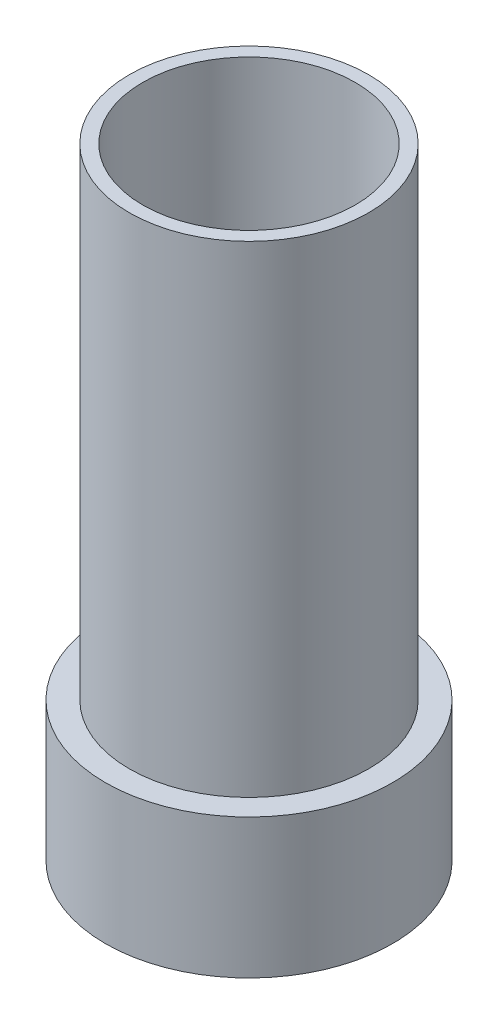
ISO-10303-21;
HEADER;
FILE_DESCRIPTION(('STEP AP214'),'2;1');
FILE_NAME('part.step','',(''),(''),'','','');
FILE_SCHEMA(('AUTOMOTIVE_DESIGN { 1 0 10303 214 1 1 1 1 }'));
ENDSEC;
DATA;
#1=APPLICATION_CONTEXT('core data for automotive mechanical design processes');
#2=APPLICATION_PROTOCOL_DEFINITION('international standard','automotive_design',2000,#1);
#3=PRODUCT_CONTEXT('',#1,'mechanical');
#4=PRODUCT('Part','Part','',(#3));
#5=PRODUCT_RELATED_PRODUCT_CATEGORY('part','',(#4));
#6=PRODUCT_DEFINITION_FORMATION('','',#4);
#7=PRODUCT_DEFINITION_CONTEXT('part definition',#1,'design');
#8=PRODUCT_DEFINITION('design','',#6,#7);
#9=PRODUCT_DEFINITION_SHAPE('','',#8);
#10=(LENGTH_UNIT() NAMED_UNIT(*) SI_UNIT(.MILLI.,.METRE.));
#11=(NAMED_UNIT(*) PLANE_ANGLE_UNIT() SI_UNIT($,.RADIAN.));
#12=(NAMED_UNIT(*) SI_UNIT($,.STERADIAN.) SOLID_ANGLE_UNIT());
#13=UNCERTAINTY_MEASURE_WITH_UNIT(LENGTH_MEASURE(1.E-05),#10,'distance_accuracy_value','');
#14=(GEOMETRIC_REPRESENTATION_CONTEXT(3) GLOBAL_UNCERTAINTY_ASSIGNED_CONTEXT((#13)) GLOBAL_UNIT_ASSIGNED_CONTEXT((#10,
#11,#12)) REPRESENTATION_CONTEXT('',''));
#15=CARTESIAN_POINT('',(0.,0.,0.));
#16=DIRECTION('',(0.,0.,1.));
#17=DIRECTION('',(1.,0.,0.));
#18=AXIS2_PLACEMENT_3D('',#15,#16,#17);
#19=CARTESIAN_POINT('',(13.6326591615901,41.2,-6.07942908557396));
#20=DIRECTION('',(0.,-1.,0.));
#21=DIRECTION('',(0.,0.,-1.));
#22=AXIS2_PLACEMENT_3D('',#19,#20,#21);
#23=CYLINDRICAL_SURFACE('',#22,7.9375);
#24=CARTESIAN_POINT('',(13.6326591615901,41.2,-6.07942908557396));
#25=DIRECTION('',(0.,1.,0.));
#26=DIRECTION('',(0.,0.,1.));
#27=AXIS2_PLACEMENT_3D('',#24,#25,#26);
#28=CIRCLE('',#27,7.9375);
#29=CARTESIAN_POINT('',(13.6326591615901,41.2,-14.016929085574));
#30=VERTEX_POINT('',#29);
#31=EDGE_CURVE('E37',#30,#30,#28,.T.);
#32=CARTESIAN_POINT('',(13.6326591615901,9.25,-6.07942908557396));
#33=DIRECTION('',(0.,-1.,0.));
#34=DIRECTION('',(0.,0.,-1.));
#35=AXIS2_PLACEMENT_3D('',#32,#33,#34);
#36=CIRCLE('',#35,7.9375);
#37=CARTESIAN_POINT('',(13.6326591615901,9.25,-14.016929085574));
#38=VERTEX_POINT('',#37);
#39=EDGE_CURVE('E10',#38,#38,#36,.T.);
#40=CARTESIAN_POINT('',(13.6326591615901,41.2,-14.016929085574));
#41=CARTESIAN_POINT('',(13.6326591615901,40.8671875,-14.016929085574));
#42=CARTESIAN_POINT('',(13.6326591615901,40.534375,-14.016929085574));
#43=CARTESIAN_POINT('',(13.6326591615901,39.86875,-14.016929085574));
#44=CARTESIAN_POINT('',(13.6326591615901,39.5359375,-14.016929085574));
#45=CARTESIAN_POINT('',(13.6326591615901,38.8703125,-14.016929085574));
#46=CARTESIAN_POINT('',(13.6326591615901,38.5375,-14.016929085574));
#47=CARTESIAN_POINT('',(13.6326591615901,37.871875,-14.016929085574));
#48=CARTESIAN_POINT('',(13.6326591615901,37.5390625,-14.016929085574));
#49=CARTESIAN_POINT('',(13.6326591615901,36.8734375,-14.016929085574));
#50=CARTESIAN_POINT('',(13.6326591615901,36.540625,-14.016929085574));
#51=CARTESIAN_POINT('',(13.6326591615901,35.875,-14.016929085574));
#52=CARTESIAN_POINT('',(13.6326591615901,35.5421875,-14.016929085574));
#53=CARTESIAN_POINT('',(13.6326591615901,34.8765625,-14.016929085574));
#54=CARTESIAN_POINT('',(13.6326591615901,34.54375,-14.016929085574));
#55=CARTESIAN_POINT('',(13.6326591615901,33.878125,-14.016929085574));
#56=CARTESIAN_POINT('',(13.6326591615901,33.5453125,-14.016929085574));
#57=CARTESIAN_POINT('',(13.6326591615901,32.8796875,-14.016929085574));
#58=CARTESIAN_POINT('',(13.6326591615901,32.546875,-14.016929085574));
#59=CARTESIAN_POINT('',(13.6326591615901,31.88125,-14.016929085574));
#60=CARTESIAN_POINT('',(13.6326591615901,31.5484375,-14.016929085574));
#61=CARTESIAN_POINT('',(13.6326591615901,30.8828125,-14.016929085574));
#62=CARTESIAN_POINT('',(13.6326591615901,30.55,-14.016929085574));
#63=CARTESIAN_POINT('',(13.6326591615901,29.884375,-14.016929085574));
#64=CARTESIAN_POINT('',(13.6326591615901,29.5515625,-14.016929085574));
#65=CARTESIAN_POINT('',(13.6326591615901,28.8859375,-14.016929085574));
#66=CARTESIAN_POINT('',(13.6326591615901,28.553125,-14.016929085574));
#67=CARTESIAN_POINT('',(13.6326591615901,27.8875,-14.016929085574));
#68=CARTESIAN_POINT('',(13.6326591615901,27.5546875,-14.016929085574));
#69=CARTESIAN_POINT('',(13.6326591615901,26.8890625,-14.016929085574));
#70=CARTESIAN_POINT('',(13.6326591615901,26.55625,-14.016929085574));
#71=CARTESIAN_POINT('',(13.6326591615901,25.890625,-14.016929085574));
#72=CARTESIAN_POINT('',(13.6326591615901,25.5578125,-14.016929085574));
#73=CARTESIAN_POINT('',(13.6326591615901,24.8921875,-14.016929085574));
#74=CARTESIAN_POINT('',(13.6326591615901,24.559375,-14.016929085574));
#75=CARTESIAN_POINT('',(13.6326591615901,23.89375,-14.016929085574));
#76=CARTESIAN_POINT('',(13.6326591615901,23.5609375,-14.016929085574));
#77=CARTESIAN_POINT('',(13.6326591615901,22.8953125,-14.016929085574));
#78=CARTESIAN_POINT('',(13.6326591615901,22.5625,-14.016929085574));
#79=CARTESIAN_POINT('',(13.6326591615901,21.896875,-14.016929085574));
#80=CARTESIAN_POINT('',(13.6326591615901,21.5640625,-14.016929085574));
#81=CARTESIAN_POINT('',(13.6326591615901,20.8984375,-14.016929085574));
#82=CARTESIAN_POINT('',(13.6326591615901,20.565625,-14.016929085574));
#83=CARTESIAN_POINT('',(13.6326591615901,19.9,-14.016929085574));
#84=CARTESIAN_POINT('',(13.6326591615901,19.5671875,-14.016929085574));
#85=CARTESIAN_POINT('',(13.6326591615901,18.9015625,-14.016929085574));
#86=CARTESIAN_POINT('',(13.6326591615901,18.56875,-14.016929085574));
#87=CARTESIAN_POINT('',(13.6326591615901,17.903125,-14.016929085574));
#88=CARTESIAN_POINT('',(13.6326591615901,17.5703125,-14.016929085574));
#89=CARTESIAN_POINT('',(13.6326591615901,16.9046875,-14.016929085574));
#90=CARTESIAN_POINT('',(13.6326591615901,16.571875,-14.016929085574));
#91=CARTESIAN_POINT('',(13.6326591615901,15.90625,-14.016929085574));
#92=CARTESIAN_POINT('',(13.6326591615901,15.5734375,-14.016929085574));
#93=CARTESIAN_POINT('',(13.6326591615901,14.9078125,-14.016929085574));
#94=CARTESIAN_POINT('',(13.6326591615901,14.575,-14.016929085574));
#95=CARTESIAN_POINT('',(13.6326591615901,13.909375,-14.016929085574));
#96=CARTESIAN_POINT('',(13.6326591615901,13.5765625,-14.016929085574));
#97=CARTESIAN_POINT('',(13.6326591615901,12.9109375,-14.016929085574));
#98=CARTESIAN_POINT('',(13.6326591615901,12.578125,-14.016929085574));
#99=CARTESIAN_POINT('',(13.6326591615901,11.9125,-14.016929085574));
#100=CARTESIAN_POINT('',(13.6326591615901,11.5796875,-14.016929085574));
#101=CARTESIAN_POINT('',(13.6326591615901,10.9140625,-14.016929085574));
#102=CARTESIAN_POINT('',(13.6326591615901,10.58125,-14.016929085574));
#103=CARTESIAN_POINT('',(13.6326591615901,9.915625,-14.016929085574));
#104=CARTESIAN_POINT('',(13.6326591615901,9.5828125,-14.016929085574));
#105=CARTESIAN_POINT('',(13.6326591615901,9.25,-14.016929085574));
#106=B_SPLINE_CURVE_WITH_KNOTS('',3,(#40,#41,#42,#43,#44,#45,#46,#47,#48,#49,#50,#51,#52,#53,
#54,#55,#56,#57,#58,#59,#60,#61,#62,#63,#64,#65,#66,#67,#68,#69,#70,#71,#72,#73,#74,#75,#76,#77,
#78,#79,#80,#81,#82,#83,#84,#85,#86,#87,#88,#89,#90,#91,#92,#93,#94,#95,#96,#97,#98,#99,#100,
#101,#102,#103,#104,#105),.UNSPECIFIED.,.F.,.F.,(4,2,2,2,2,2,2,2,2,2,2,2,2,2,2,2,2,2,2,2,2,2,2,
2,2,2,2,2,2,2,2,2,4),(0.,0.998437500000005,1.996875,2.99531250000001,3.99375,4.9921875,
5.99062500000001,6.9890625,7.9875,8.98593750000001,9.984375,10.9828125,11.98125,12.9796875,
13.978125,14.9765625,15.975,16.9734375,17.971875,18.9703125,19.96875,20.9671875,21.965625,
22.9640625,23.9625,24.9609375,25.959375,26.9578125,27.95625,28.9546875,29.953125,30.9515625,
31.95),.UNSPECIFIED.);
#107=EDGE_CURVE('BSEAM31',#30,#38,#106,.T.);
#108=ORIENTED_EDGE('',*,*,#31,.F.);
#109=ORIENTED_EDGE('',*,*,#39,.F.);
#110=ORIENTED_EDGE('',*,*,#107,.T.);
#111=ORIENTED_EDGE('',*,*,#107,.F.);
#112=EDGE_LOOP('',(#108,#110,#109,#111));
#113=FACE_BOUND('',#112,.T.);
#114=ADVANCED_FACE('F31',(#113),#23,.T.);
#115=CARTESIAN_POINT('',(13.6326591615901,41.2,-6.07942908557396));
#116=DIRECTION('',(0.,1.,0.));
#117=DIRECTION('',(0.,0.,1.));
#118=AXIS2_PLACEMENT_3D('',#115,#116,#117);
#119=PLANE('',#118);
#120=ORIENTED_EDGE('',*,*,#31,.T.);
#121=EDGE_LOOP('',(#120));
#122=FACE_BOUND('',#121,.T.);
#123=CARTESIAN_POINT('',(13.6326591615901,41.2,-6.07942908557396));
#124=DIRECTION('',(0.,1.,0.));
#125=DIRECTION('',(0.,0.,1.));
#126=AXIS2_PLACEMENT_3D('',#123,#124,#125);
#127=CIRCLE('',#126,7.0485);
#128=CARTESIAN_POINT('',(13.6326591615901,41.2,-13.127929085574));
#129=VERTEX_POINT('',#128);
#130=EDGE_CURVE('E41',#129,#129,#127,.T.);
#131=ORIENTED_EDGE('',*,*,#130,.F.);
#132=EDGE_LOOP('',(#131));
#133=FACE_BOUND('',#132,.T.);
#134=ADVANCED_FACE('F69',(#122,#133),#119,.T.);
#135=CARTESIAN_POINT('',(13.6326591615901,0.,-6.07942908557396));
#136=DIRECTION('',(0.,1.,0.));
#137=DIRECTION('',(0.,0.,1.));
#138=AXIS2_PLACEMENT_3D('',#135,#136,#137);
#139=PLANE('',#138);
#140=CARTESIAN_POINT('',(13.6326591615901,0.,-6.07942908557396));
#141=DIRECTION('',(0.,1.,0.));
#142=DIRECTION('',(0.,0.,1.));
#143=AXIS2_PLACEMENT_3D('',#140,#141,#142);
#144=CIRCLE('',#143,7.0485);
#145=CARTESIAN_POINT('',(13.6326591615901,0.,-13.127929085574));
#146=VERTEX_POINT('',#145);
#147=EDGE_CURVE('E45',#146,#146,#144,.T.);
#148=ORIENTED_EDGE('',*,*,#147,.T.);
#149=EDGE_LOOP('',(#148));
#150=FACE_BOUND('',#149,.T.);
#151=CARTESIAN_POINT('',(13.6326591615901,0.,-6.07942908557396));
#152=DIRECTION('',(0.,-1.,0.));
#153=DIRECTION('',(0.,0.,-1.));
#154=AXIS2_PLACEMENT_3D('',#151,#152,#153);
#155=CIRCLE('',#154,9.525);
#156=CARTESIAN_POINT('',(13.6326591615901,0.,-15.604429085574));
#157=VERTEX_POINT('',#156);
#158=EDGE_CURVE('E51',#157,#157,#155,.T.);
#159=ORIENTED_EDGE('',*,*,#158,.T.);
#160=EDGE_LOOP('',(#159));
#161=FACE_BOUND('',#160,.T.);
#162=ADVANCED_FACE('F74',(#150,#161),#139,.F.);
#163=CARTESIAN_POINT('',(13.6326591615901,41.2,-6.07942908557396));
#164=DIRECTION('',(0.,-1.,0.));
#165=DIRECTION('',(0.,0.,-1.));
#166=AXIS2_PLACEMENT_3D('',#163,#164,#165);
#167=CYLINDRICAL_SURFACE('',#166,7.0485);
#168=CARTESIAN_POINT('',(13.6326591615901,41.2,-13.127929085574));
#169=CARTESIAN_POINT('',(13.6326591615901,40.7708333333333,-13.127929085574));
#170=CARTESIAN_POINT('',(13.6326591615901,40.3416666666667,-13.127929085574));
#171=CARTESIAN_POINT('',(13.6326591615901,39.4833333333333,-13.127929085574));
#172=CARTESIAN_POINT('',(13.6326591615901,39.0541666666667,-13.127929085574));
#173=CARTESIAN_POINT('',(13.6326591615901,38.1958333333333,-13.127929085574));
#174=CARTESIAN_POINT('',(13.6326591615901,37.7666666666667,-13.127929085574));
#175=CARTESIAN_POINT('',(13.6326591615901,36.9083333333333,-13.127929085574));
#176=CARTESIAN_POINT('',(13.6326591615901,36.4791666666667,-13.127929085574));
#177=CARTESIAN_POINT('',(13.6326591615901,35.6208333333333,-13.127929085574));
#178=CARTESIAN_POINT('',(13.6326591615901,35.1916666666667,-13.127929085574));
#179=CARTESIAN_POINT('',(13.6326591615901,34.3333333333333,-13.127929085574));
#180=CARTESIAN_POINT('',(13.6326591615901,33.9041666666667,-13.127929085574));
#181=CARTESIAN_POINT('',(13.6326591615901,33.0458333333333,-13.127929085574));
#182=CARTESIAN_POINT('',(13.6326591615901,32.6166666666667,-13.127929085574));
#183=CARTESIAN_POINT('',(13.6326591615901,31.7583333333333,-13.127929085574));
#184=CARTESIAN_POINT('',(13.6326591615901,31.3291666666667,-13.127929085574));
#185=CARTESIAN_POINT('',(13.6326591615901,30.4708333333333,-13.127929085574));
#186=CARTESIAN_POINT('',(13.6326591615901,30.0416666666667,-13.127929085574));
#187=CARTESIAN_POINT('',(13.6326591615901,29.1833333333333,-13.127929085574));
#188=CARTESIAN_POINT('',(13.6326591615901,28.7541666666667,-13.127929085574));
#189=CARTESIAN_POINT('',(13.6326591615901,27.8958333333333,-13.127929085574));
#190=CARTESIAN_POINT('',(13.6326591615901,27.4666666666667,-13.127929085574));
#191=CARTESIAN_POINT('',(13.6326591615901,26.6083333333333,-13.127929085574));
#192=CARTESIAN_POINT('',(13.6326591615901,26.1791666666667,-13.127929085574));
#193=CARTESIAN_POINT('',(13.6326591615901,25.3208333333333,-13.127929085574));
#194=CARTESIAN_POINT('',(13.6326591615901,24.8916666666667,-13.127929085574));
#195=CARTESIAN_POINT('',(13.6326591615901,24.0333333333333,-13.127929085574));
#196=CARTESIAN_POINT('',(13.6326591615901,23.6041666666667,-13.127929085574));
#197=CARTESIAN_POINT('',(13.6326591615901,22.7458333333333,-13.127929085574));
#198=CARTESIAN_POINT('',(13.6326591615901,22.3166666666667,-13.127929085574));
#199=CARTESIAN_POINT('',(13.6326591615901,21.4583333333333,-13.127929085574));
#200=CARTESIAN_POINT('',(13.6326591615901,21.0291666666667,-13.127929085574));
#201=CARTESIAN_POINT('',(13.6326591615901,20.1708333333333,-13.127929085574));
#202=CARTESIAN_POINT('',(13.6326591615901,19.7416666666667,-13.127929085574));
#203=CARTESIAN_POINT('',(13.6326591615901,18.8833333333333,-13.127929085574));
#204=CARTESIAN_POINT('',(13.6326591615901,18.4541666666667,-13.127929085574));
#205=CARTESIAN_POINT('',(13.6326591615901,17.5958333333333,-13.127929085574));
#206=CARTESIAN_POINT('',(13.6326591615901,17.1666666666667,-13.127929085574));
#207=CARTESIAN_POINT('',(13.6326591615901,16.3083333333333,-13.127929085574));
#208=CARTESIAN_POINT('',(13.6326591615901,15.8791666666667,-13.127929085574));
#209=CARTESIAN_POINT('',(13.6326591615901,15.0208333333333,-13.127929085574));
#210=CARTESIAN_POINT('',(13.6326591615901,14.5916666666667,-13.127929085574));
#211=CARTESIAN_POINT('',(13.6326591615901,13.7333333333333,-13.127929085574));
#212=CARTESIAN_POINT('',(13.6326591615901,13.3041666666667,-13.127929085574));
#213=CARTESIAN_POINT('',(13.6326591615901,12.4458333333333,-13.127929085574));
#214=CARTESIAN_POINT('',(13.6326591615901,12.0166666666667,-13.127929085574));
#215=CARTESIAN_POINT('',(13.6326591615901,11.1583333333333,-13.127929085574));
#216=CARTESIAN_POINT('',(13.6326591615901,10.7291666666667,-13.127929085574));
#217=CARTESIAN_POINT('',(13.6326591615901,9.87083333333333,-13.127929085574));
#218=CARTESIAN_POINT('',(13.6326591615901,9.44166666666666,-13.127929085574));
#219=CARTESIAN_POINT('',(13.6326591615901,8.58333333333333,-13.127929085574));
#220=CARTESIAN_POINT('',(13.6326591615901,8.15416666666666,-13.127929085574));
#221=CARTESIAN_POINT('',(13.6326591615901,7.29583333333333,-13.127929085574));
#222=CARTESIAN_POINT('',(13.6326591615901,6.86666666666666,-13.127929085574));
#223=CARTESIAN_POINT('',(13.6326591615901,6.00833333333333,-13.127929085574));
#224=CARTESIAN_POINT('',(13.6326591615901,5.57916666666666,-13.127929085574));
#225=CARTESIAN_POINT('',(13.6326591615901,4.72083333333333,-13.127929085574));
#226=CARTESIAN_POINT('',(13.6326591615901,4.29166666666666,-13.127929085574));
#227=CARTESIAN_POINT('',(13.6326591615901,3.43333333333333,-13.127929085574));
#228=CARTESIAN_POINT('',(13.6326591615901,3.00416666666666,-13.127929085574));
#229=CARTESIAN_POINT('',(13.6326591615901,2.14583333333333,-13.127929085574));
#230=CARTESIAN_POINT('',(13.6326591615901,1.71666666666666,-13.127929085574));
#231=CARTESIAN_POINT('',(13.6326591615901,0.858333333333324,-13.127929085574));
#232=CARTESIAN_POINT('',(13.6326591615901,0.429166666666659,-13.127929085574));
#233=CARTESIAN_POINT('',(13.6326591615901,0.,-13.127929085574));
#234=B_SPLINE_CURVE_WITH_KNOTS('',3,(#168,#169,#170,#171,#172,#173,#174,#175,#176,#177,#178,
#179,#180,#181,#182,#183,#184,#185,#186,#187,#188,#189,#190,#191,#192,#193,#194,#195,#196,#197,
#198,#199,#200,#201,#202,#203,#204,#205,#206,#207,#208,#209,#210,#211,#212,#213,#214,#215,#216,
#217,#218,#219,#220,#221,#222,#223,#224,#225,#226,#227,#228,#229,#230,#231,#232,#233),
.UNSPECIFIED.,.F.,.F.,(4,2,2,2,2,2,2,2,2,2,2,2,2,2,2,2,2,2,2,2,2,2,2,2,2,2,2,2,2,2,2,2,4),(0.,
1.2875,2.57499999999999,3.8625,5.15,6.4375,7.725,9.0125,10.3,11.5875,12.875,14.1625,15.45,
16.7375,18.025,19.3125,20.6,21.8875,23.175,24.4625,25.75,27.0375,28.325,29.6125,30.9,32.1875,
33.475,34.7625,36.05,37.3375,38.625,39.9125,41.2),.UNSPECIFIED.);
#235=EDGE_CURVE('BSEAM66',#129,#146,#234,.T.);
#236=ORIENTED_EDGE('',*,*,#130,.T.);
#237=ORIENTED_EDGE('',*,*,#147,.F.);
#238=ORIENTED_EDGE('',*,*,#235,.T.);
#239=ORIENTED_EDGE('',*,*,#235,.F.);
#240=EDGE_LOOP('',(#236,#238,#237,#239));
#241=FACE_BOUND('',#240,.T.);
#242=ADVANCED_FACE('F66',(#241),#167,.F.);
#243=CARTESIAN_POINT('',(13.6326591615901,9.25,-6.07942908557396));
#244=DIRECTION('',(0.,-1.,0.));
#245=DIRECTION('',(0.,0.,-1.));
#246=AXIS2_PLACEMENT_3D('',#243,#244,#245);
#247=CYLINDRICAL_SURFACE('',#246,9.525);
#248=CARTESIAN_POINT('',(13.6326591615901,9.25,-6.07942908557396));
#249=DIRECTION('',(0.,-1.,0.));
#250=DIRECTION('',(0.,0.,-1.));
#251=AXIS2_PLACEMENT_3D('',#248,#249,#250);
#252=CIRCLE('',#251,9.525);
#253=CARTESIAN_POINT('',(13.6326591615901,9.25,-15.604429085574));
#254=VERTEX_POINT('',#253);
#255=EDGE_CURVE('E49',#254,#254,#252,.T.);
#256=ORIENTED_EDGE('',*,*,#255,.T.);
#257=EDGE_LOOP('',(#256));
#258=FACE_BOUND('',#257,.T.);
#259=ORIENTED_EDGE('',*,*,#158,.F.);
#260=EDGE_LOOP('',(#259));
#261=FACE_BOUND('',#260,.T.);
#262=ADVANCED_FACE('F57',(#258,#261),#247,.T.);
#263=CARTESIAN_POINT('',(13.6326591615901,9.25,-6.07942908557396));
#264=DIRECTION('',(0.,-1.,0.));
#265=DIRECTION('',(0.,0.,-1.));
#266=AXIS2_PLACEMENT_3D('',#263,#264,#265);
#267=PLANE('',#266);
#268=ORIENTED_EDGE('',*,*,#39,.T.);
#269=EDGE_LOOP('',(#268));
#270=FACE_BOUND('',#269,.T.);
#271=ORIENTED_EDGE('',*,*,#255,.F.);
#272=EDGE_LOOP('',(#271));
#273=FACE_BOUND('',#272,.T.);
#274=ADVANCED_FACE('F60',(#270,#273),#267,.F.);
#275=CLOSED_SHELL('',(#114,#134,#162,#242,#262,#274));
#276=MANIFOLD_SOLID_BREP('B2',#275);
#277=ADVANCED_BREP_SHAPE_REPRESENTATION('',(#18,#276),#14);
#278=SHAPE_DEFINITION_REPRESENTATION(#9,#277);
ENDSEC;
END-ISO-10303-21;
